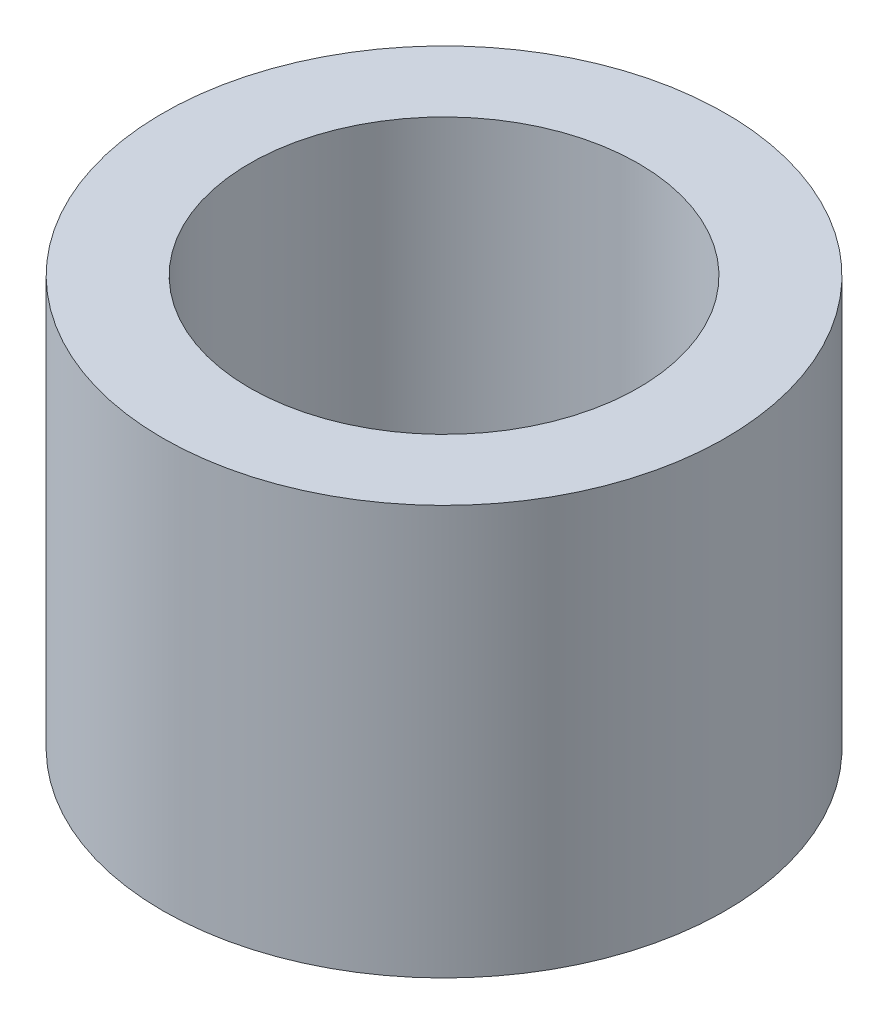
ISO-10303-21;
HEADER;
FILE_DESCRIPTION(('STEP AP214'),'2;1');
FILE_NAME('part.step','',(''),(''),'','','');
FILE_SCHEMA(('AUTOMOTIVE_DESIGN { 1 0 10303 214 1 1 1 1 }'));
ENDSEC;
DATA;
#1=APPLICATION_CONTEXT('core data for automotive mechanical design processes');
#2=APPLICATION_PROTOCOL_DEFINITION('international standard','automotive_design',2000,#1);
#3=PRODUCT_CONTEXT('',#1,'mechanical');
#4=PRODUCT('Part','Part','',(#3));
#5=PRODUCT_RELATED_PRODUCT_CATEGORY('part','',(#4));
#6=PRODUCT_DEFINITION_FORMATION('','',#4);
#7=PRODUCT_DEFINITION_CONTEXT('part definition',#1,'design');
#8=PRODUCT_DEFINITION('design','',#6,#7);
#9=PRODUCT_DEFINITION_SHAPE('','',#8);
#10=(LENGTH_UNIT() NAMED_UNIT(*) SI_UNIT(.MILLI.,.METRE.));
#11=(NAMED_UNIT(*) PLANE_ANGLE_UNIT() SI_UNIT($,.RADIAN.));
#12=(NAMED_UNIT(*) SI_UNIT($,.STERADIAN.) SOLID_ANGLE_UNIT());
#13=UNCERTAINTY_MEASURE_WITH_UNIT(LENGTH_MEASURE(1.E-05),#10,'distance_accuracy_value','');
#14=(GEOMETRIC_REPRESENTATION_CONTEXT(3) GLOBAL_UNCERTAINTY_ASSIGNED_CONTEXT((#13)) GLOBAL_UNIT_ASSIGNED_CONTEXT((#10,
#11,#12)) REPRESENTATION_CONTEXT('',''));
#15=CARTESIAN_POINT('',(0.,0.,0.));
#16=DIRECTION('',(0.,0.,1.));
#17=DIRECTION('',(1.,0.,0.));
#18=AXIS2_PLACEMENT_3D('',#15,#16,#17);
#19=CARTESIAN_POINT('',(0.,4.,0.));
#20=DIRECTION('',(0.,1.,0.));
#21=DIRECTION('',(0.,0.,1.));
#22=AXIS2_PLACEMENT_3D('',#19,#20,#21);
#23=PLANE('',#22);
#24=CARTESIAN_POINT('',(0.,4.,0.));
#25=DIRECTION('',(0.,1.,0.));
#26=DIRECTION('',(0.,0.,1.));
#27=AXIS2_PLACEMENT_3D('',#24,#25,#26);
#28=CIRCLE('',#27,2.75);
#29=CARTESIAN_POINT('',(0.,4.,2.75));
#30=VERTEX_POINT('',#29);
#31=EDGE_CURVE('E10',#30,#30,#28,.T.);
#32=ORIENTED_EDGE('',*,*,#31,.T.);
#33=EDGE_LOOP('',(#32));
#34=FACE_BOUND('',#33,.T.);
#35=CARTESIAN_POINT('',(0.,4.,0.));
#36=DIRECTION('',(0.,1.,0.));
#37=DIRECTION('',(0.,0.,1.));
#38=AXIS2_PLACEMENT_3D('',#35,#36,#37);
#39=CIRCLE('',#38,1.9);
#40=CARTESIAN_POINT('',(0.,4.,1.9));
#41=VERTEX_POINT('',#40);
#42=EDGE_CURVE('E45',#41,#41,#39,.T.);
#43=ORIENTED_EDGE('',*,*,#42,.F.);
#44=EDGE_LOOP('',(#43));
#45=FACE_BOUND('',#44,.T.);
#46=ADVANCED_FACE('F34',(#34,#45),#23,.T.);
#47=CARTESIAN_POINT('',(0.,0.,0.));
#48=DIRECTION('',(0.,1.,0.));
#49=DIRECTION('',(0.,0.,1.));
#50=AXIS2_PLACEMENT_3D('',#47,#48,#49);
#51=PLANE('',#50);
#52=CARTESIAN_POINT('',(0.,0.,0.));
#53=DIRECTION('',(0.,1.,0.));
#54=DIRECTION('',(0.,0.,1.));
#55=AXIS2_PLACEMENT_3D('',#52,#53,#54);
#56=CIRCLE('',#55,2.75);
#57=CARTESIAN_POINT('',(0.,0.,2.75));
#58=VERTEX_POINT('',#57);
#59=EDGE_CURVE('E38',#58,#58,#56,.T.);
#60=ORIENTED_EDGE('',*,*,#59,.F.);
#61=EDGE_LOOP('',(#60));
#62=FACE_BOUND('',#61,.T.);
#63=CARTESIAN_POINT('',(0.,0.,0.));
#64=DIRECTION('',(0.,1.,0.));
#65=DIRECTION('',(0.,0.,1.));
#66=AXIS2_PLACEMENT_3D('',#63,#64,#65);
#67=CIRCLE('',#66,1.9);
#68=CARTESIAN_POINT('',(0.,0.,1.9));
#69=VERTEX_POINT('',#68);
#70=EDGE_CURVE('E47',#69,#69,#67,.T.);
#71=ORIENTED_EDGE('',*,*,#70,.T.);
#72=EDGE_LOOP('',(#71));
#73=FACE_BOUND('',#72,.T.);
#74=ADVANCED_FACE('F57',(#62,#73),#51,.F.);
#75=CARTESIAN_POINT('',(0.,4.,0.));
#76=DIRECTION('',(0.,-1.,0.));
#77=DIRECTION('',(0.,0.,-1.));
#78=AXIS2_PLACEMENT_3D('',#75,#76,#77);
#79=CYLINDRICAL_SURFACE('',#78,2.75);
#80=ORIENTED_EDGE('',*,*,#31,.F.);
#81=EDGE_LOOP('',(#80));
#82=FACE_BOUND('',#81,.T.);
#83=ORIENTED_EDGE('',*,*,#59,.T.);
#84=EDGE_LOOP('',(#83));
#85=FACE_BOUND('',#84,.T.);
#86=ADVANCED_FACE('F36',(#82,#85),#79,.T.);
#87=CARTESIAN_POINT('',(0.,4.,0.));
#88=DIRECTION('',(0.,-1.,0.));
#89=DIRECTION('',(0.,0.,-1.));
#90=AXIS2_PLACEMENT_3D('',#87,#88,#89);
#91=CYLINDRICAL_SURFACE('',#90,1.9);
#92=ORIENTED_EDGE('',*,*,#42,.T.);
#93=EDGE_LOOP('',(#92));
#94=FACE_BOUND('',#93,.T.);
#95=ORIENTED_EDGE('',*,*,#70,.F.);
#96=EDGE_LOOP('',(#95));
#97=FACE_BOUND('',#96,.T.);
#98=ADVANCED_FACE('F53',(#94,#97),#91,.F.);
#99=CLOSED_SHELL('',(#46,#74,#86,#98));
#100=MANIFOLD_SOLID_BREP('B2',#99);
#101=ADVANCED_BREP_SHAPE_REPRESENTATION('',(#18,#100),#14);
#102=SHAPE_DEFINITION_REPRESENTATION(#9,#101);
ENDSEC;
END-ISO-10303-21;
